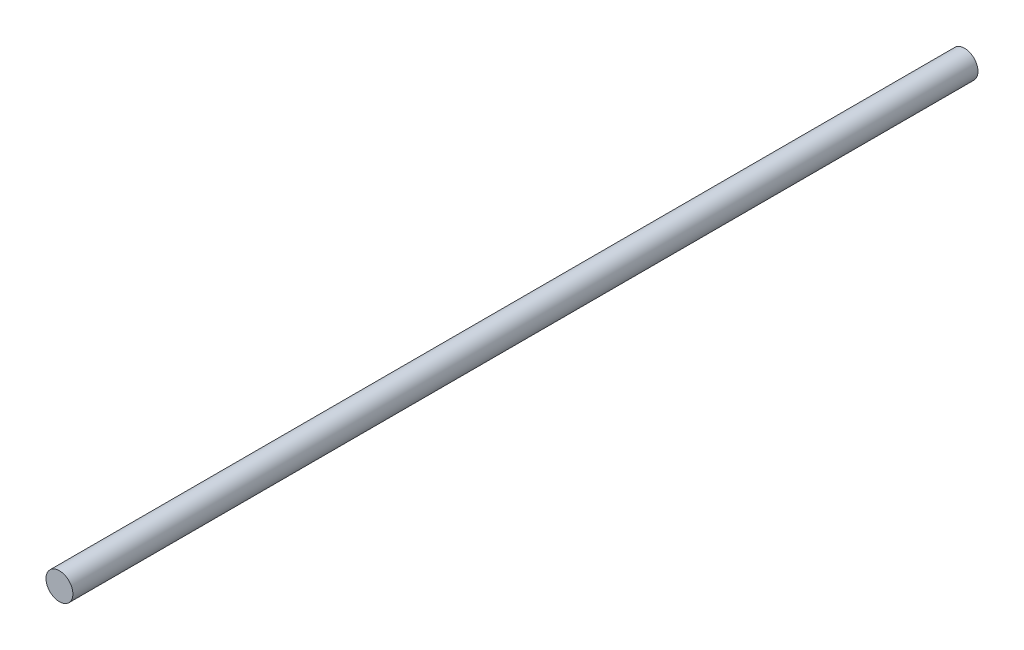
ISO-10303-21;
HEADER;
FILE_DESCRIPTION(('STEP AP214'),'2;1');
FILE_NAME('part.step','',(''),(''),'','','');
FILE_SCHEMA(('AUTOMOTIVE_DESIGN { 1 0 10303 214 1 1 1 1 }'));
ENDSEC;
DATA;
#1=APPLICATION_CONTEXT('core data for automotive mechanical design processes');
#2=APPLICATION_PROTOCOL_DEFINITION('international standard','automotive_design',2000,#1);
#3=PRODUCT_CONTEXT('',#1,'mechanical');
#4=PRODUCT('Part','Part','',(#3));
#5=PRODUCT_RELATED_PRODUCT_CATEGORY('part','',(#4));
#6=PRODUCT_DEFINITION_FORMATION('','',#4);
#7=PRODUCT_DEFINITION_CONTEXT('part definition',#1,'design');
#8=PRODUCT_DEFINITION('design','',#6,#7);
#9=PRODUCT_DEFINITION_SHAPE('','',#8);
#10=(LENGTH_UNIT() NAMED_UNIT(*) SI_UNIT(.MILLI.,.METRE.));
#11=(NAMED_UNIT(*) PLANE_ANGLE_UNIT() SI_UNIT($,.RADIAN.));
#12=(NAMED_UNIT(*) SI_UNIT($,.STERADIAN.) SOLID_ANGLE_UNIT());
#13=UNCERTAINTY_MEASURE_WITH_UNIT(LENGTH_MEASURE(1.E-05),#10,'distance_accuracy_value','');
#14=(GEOMETRIC_REPRESENTATION_CONTEXT(3) GLOBAL_UNCERTAINTY_ASSIGNED_CONTEXT((#13)) GLOBAL_UNIT_ASSIGNED_CONTEXT((#10,
#11,#12)) REPRESENTATION_CONTEXT('',''));
#15=CARTESIAN_POINT('',(0.,0.,0.));
#16=DIRECTION('',(0.,0.,1.));
#17=DIRECTION('',(1.,0.,0.));
#18=AXIS2_PLACEMENT_3D('',#15,#16,#17);
#19=CARTESIAN_POINT('',(0.,0.,270.));
#20=DIRECTION('',(0.,0.,-1.));
#21=DIRECTION('',(-1.,0.,0.));
#22=AXIS2_PLACEMENT_3D('',#19,#20,#21);
#23=CYLINDRICAL_SURFACE('',#22,8.025);
#24=CARTESIAN_POINT('',(0.,0.,270.));
#25=DIRECTION('',(0.,0.,1.));
#26=DIRECTION('',(1.,0.,0.));
#27=AXIS2_PLACEMENT_3D('',#24,#25,#26);
#28=CIRCLE('',#27,8.025);
#29=CARTESIAN_POINT('',(8.025,0.,270.));
#30=VERTEX_POINT('',#29);
#31=EDGE_CURVE('E10',#30,#30,#28,.T.);
#32=ORIENTED_EDGE('',*,*,#31,.F.);
#33=EDGE_LOOP('',(#32));
#34=FACE_BOUND('',#33,.T.);
#35=CARTESIAN_POINT('',(0.,0.,-270.));
#36=DIRECTION('',(0.,0.,1.));
#37=DIRECTION('',(1.,0.,0.));
#38=AXIS2_PLACEMENT_3D('',#35,#36,#37);
#39=CIRCLE('',#38,8.025);
#40=CARTESIAN_POINT('',(8.025,0.,-270.));
#41=VERTEX_POINT('',#40);
#42=EDGE_CURVE('E34',#41,#41,#39,.T.);
#43=ORIENTED_EDGE('',*,*,#42,.T.);
#44=EDGE_LOOP('',(#43));
#45=FACE_BOUND('',#44,.T.);
#46=ADVANCED_FACE('F31',(#34,#45),#23,.T.);
#47=CARTESIAN_POINT('',(0.,0.,270.));
#48=DIRECTION('',(0.,0.,1.));
#49=DIRECTION('',(1.,0.,0.));
#50=AXIS2_PLACEMENT_3D('',#47,#48,#49);
#51=PLANE('',#50);
#52=ORIENTED_EDGE('',*,*,#31,.T.);
#53=EDGE_LOOP('',(#52));
#54=FACE_BOUND('',#53,.T.);
#55=ADVANCED_FACE('F46',(#54),#51,.T.);
#56=CARTESIAN_POINT('',(0.,0.,-270.));
#57=DIRECTION('',(0.,0.,1.));
#58=DIRECTION('',(1.,0.,0.));
#59=AXIS2_PLACEMENT_3D('',#56,#57,#58);
#60=PLANE('',#59);
#61=ORIENTED_EDGE('',*,*,#42,.F.);
#62=EDGE_LOOP('',(#61));
#63=FACE_BOUND('',#62,.T.);
#64=ADVANCED_FACE('F44',(#63),#60,.F.);
#65=CLOSED_SHELL('',(#46,#55,#64));
#66=MANIFOLD_SOLID_BREP('B2',#65);
#67=ADVANCED_BREP_SHAPE_REPRESENTATION('',(#18,#66),#14);
#68=SHAPE_DEFINITION_REPRESENTATION(#9,#67);
ENDSEC;
END-ISO-10303-21;
